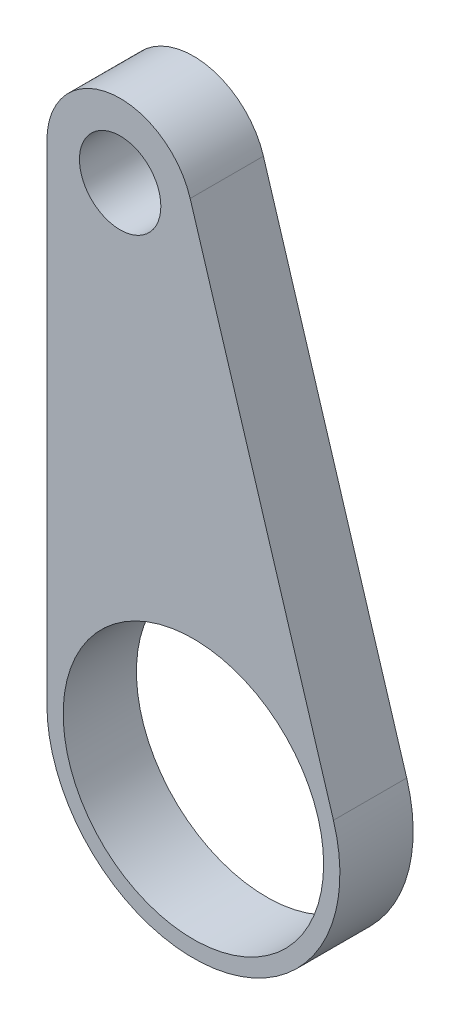
ISO-10303-21;
HEADER;
FILE_DESCRIPTION(('STEP AP214'),'2;1');
FILE_NAME('part.step','',(''),(''),'','','');
FILE_SCHEMA(('AUTOMOTIVE_DESIGN { 1 0 10303 214 1 1 1 1 }'));
ENDSEC;
DATA;
#1=APPLICATION_CONTEXT('core data for automotive mechanical design processes');
#2=APPLICATION_PROTOCOL_DEFINITION('international standard','automotive_design',2000,#1);
#3=PRODUCT_CONTEXT('',#1,'mechanical');
#4=PRODUCT('Part','Part','',(#3));
#5=PRODUCT_RELATED_PRODUCT_CATEGORY('part','',(#4));
#6=PRODUCT_DEFINITION_FORMATION('','',#4);
#7=PRODUCT_DEFINITION_CONTEXT('part definition',#1,'design');
#8=PRODUCT_DEFINITION('design','',#6,#7);
#9=PRODUCT_DEFINITION_SHAPE('','',#8);
#10=(LENGTH_UNIT() NAMED_UNIT(*) SI_UNIT(.MILLI.,.METRE.));
#11=(NAMED_UNIT(*) PLANE_ANGLE_UNIT() SI_UNIT($,.RADIAN.));
#12=(NAMED_UNIT(*) SI_UNIT($,.STERADIAN.) SOLID_ANGLE_UNIT());
#13=UNCERTAINTY_MEASURE_WITH_UNIT(LENGTH_MEASURE(1.E-05),#10,'distance_accuracy_value','');
#14=(GEOMETRIC_REPRESENTATION_CONTEXT(3) GLOBAL_UNCERTAINTY_ASSIGNED_CONTEXT((#13)) GLOBAL_UNIT_ASSIGNED_CONTEXT((#10,
#11,#12)) REPRESENTATION_CONTEXT('',''));
#15=CARTESIAN_POINT('',(0.,0.,0.));
#16=DIRECTION('',(0.,0.,1.));
#17=DIRECTION('',(1.,0.,0.));
#18=AXIS2_PLACEMENT_3D('',#15,#16,#17);
#19=CARTESIAN_POINT('',(-9.,0.,4.5));
#20=DIRECTION('',(-1.,0.,0.));
#21=DIRECTION('',(0.,0.,1.));
#22=AXIS2_PLACEMENT_3D('',#19,#20,#21);
#23=PLANE('',#22);
#24=DIRECTION('',(0.,1.,0.));
#25=VECTOR('',#24,1.);
#26=CARTESIAN_POINT('',(-9.,0.,0.));
#27=LINE('',#26,#25);
#28=CARTESIAN_POINT('',(-9.,0.,0.));
#29=VERTEX_POINT('',#28);
#30=CARTESIAN_POINT('',(-9.,30.,0.));
#31=VERTEX_POINT('',#30);
#32=EDGE_CURVE('E130',#29,#31,#27,.T.);
#33=ORIENTED_EDGE('',*,*,#32,.F.);
#34=DIRECTION('',(0.,0.,-1.));
#35=VECTOR('',#34,1.);
#36=CARTESIAN_POINT('',(-9.,0.,4.5));
#37=LINE('',#36,#35);
#38=CARTESIAN_POINT('',(-9.,0.,4.5));
#39=VERTEX_POINT('',#38);
#40=EDGE_CURVE('E88',#39,#29,#37,.T.);
#41=ORIENTED_EDGE('',*,*,#40,.F.);
#42=DIRECTION('',(0.,1.,0.));
#43=VECTOR('',#42,1.);
#44=CARTESIAN_POINT('',(-9.,0.,4.5));
#45=LINE('',#44,#43);
#46=CARTESIAN_POINT('',(-9.,30.,4.5));
#47=VERTEX_POINT('',#46);
#48=EDGE_CURVE('E128',#39,#47,#45,.T.);
#49=ORIENTED_EDGE('',*,*,#48,.T.);
#50=DIRECTION('',(0.,0.,-1.));
#51=VECTOR('',#50,1.);
#52=CARTESIAN_POINT('',(-9.,30.,4.5));
#53=LINE('',#52,#51);
#54=EDGE_CURVE('E12',#47,#31,#53,.T.);
#55=ORIENTED_EDGE('',*,*,#54,.T.);
#56=EDGE_LOOP('',(#33,#41,#49,#55));
#57=FACE_BOUND('',#56,.T.);
#58=ADVANCED_FACE('F77',(#57),#23,.T.);
#59=CARTESIAN_POINT('',(8.6039119804401,2.64058679706602,4.5));
#60=DIRECTION('',(-0.9559902200489,-0.293398533007335,0.));
#61=DIRECTION('',(0.293398533007335,-0.9559902200489,0.));
#62=AXIS2_PLACEMENT_3D('',#59,#60,#61);
#63=PLANE('',#62);
#64=DIRECTION('',(-0.293398533007335,0.9559902200489,0.));
#65=VECTOR('',#64,1.);
#66=CARTESIAN_POINT('',(8.6039119804401,2.64058679706602,0.));
#67=LINE('',#66,#65);
#68=CARTESIAN_POINT('',(8.6039119804401,2.64058679706602,0.));
#69=VERTEX_POINT('',#68);
#70=CARTESIAN_POINT('',(-0.198044009779951,31.320293398533,0.));
#71=VERTEX_POINT('',#70);
#72=EDGE_CURVE('E159',#69,#71,#67,.T.);
#73=ORIENTED_EDGE('',*,*,#72,.T.);
#74=DIRECTION('',(0.,0.,-1.));
#75=VECTOR('',#74,1.);
#76=CARTESIAN_POINT('',(-0.198044009779951,31.320293398533,4.5));
#77=LINE('',#76,#75);
#78=CARTESIAN_POINT('',(-0.198044009779951,31.320293398533,4.5));
#79=VERTEX_POINT('',#78);
#80=EDGE_CURVE('E119',#79,#71,#77,.T.);
#81=ORIENTED_EDGE('',*,*,#80,.F.);
#82=DIRECTION('',(-0.293398533007335,0.9559902200489,0.));
#83=VECTOR('',#82,1.);
#84=CARTESIAN_POINT('',(8.6039119804401,2.64058679706602,4.5));
#85=LINE('',#84,#83);
#86=CARTESIAN_POINT('',(8.6039119804401,2.64058679706602,4.5));
#87=VERTEX_POINT('',#86);
#88=EDGE_CURVE('E97',#87,#79,#85,.T.);
#89=ORIENTED_EDGE('',*,*,#88,.F.);
#90=DIRECTION('',(0.,0.,-1.));
#91=VECTOR('',#90,1.);
#92=CARTESIAN_POINT('',(8.6039119804401,2.64058679706602,4.5));
#93=LINE('',#92,#91);
#94=EDGE_CURVE('E112',#87,#69,#93,.T.);
#95=ORIENTED_EDGE('',*,*,#94,.T.);
#96=EDGE_LOOP('',(#73,#81,#89,#95));
#97=FACE_BOUND('',#96,.T.);
#98=ADVANCED_FACE('F188',(#97),#63,.F.);
#99=CARTESIAN_POINT('',(-4.5,30.,4.5));
#100=DIRECTION('',(0.,0.,-1.));
#101=DIRECTION('',(-1.,0.,0.));
#102=AXIS2_PLACEMENT_3D('',#99,#100,#101);
#103=CYLINDRICAL_SURFACE('',#102,4.5);
#104=CARTESIAN_POINT('',(-4.5,30.,0.));
#105=DIRECTION('',(0.,0.,1.));
#106=DIRECTION('',(1.,0.,0.));
#107=AXIS2_PLACEMENT_3D('',#104,#105,#106);
#108=CIRCLE('',#107,4.5);
#109=EDGE_CURVE('E153',#31,#71,#108,.F.);
#110=ORIENTED_EDGE('',*,*,#109,.F.);
#111=ORIENTED_EDGE('',*,*,#54,.F.);
#112=CARTESIAN_POINT('',(-4.5,30.,4.5));
#113=DIRECTION('',(0.,0.,1.));
#114=DIRECTION('',(1.,0.,0.));
#115=AXIS2_PLACEMENT_3D('',#112,#113,#114);
#116=CIRCLE('',#115,4.5);
#117=EDGE_CURVE('E140',#47,#79,#116,.F.);
#118=ORIENTED_EDGE('',*,*,#117,.T.);
#119=ORIENTED_EDGE('',*,*,#80,.T.);
#120=EDGE_LOOP('',(#110,#111,#118,#119));
#121=FACE_BOUND('',#120,.T.);
#122=ADVANCED_FACE('F193',(#121),#103,.T.);
#123=CARTESIAN_POINT('',(-4.5,30.,4.5));
#124=DIRECTION('',(0.,0.,-1.));
#125=DIRECTION('',(-1.,0.,0.));
#126=AXIS2_PLACEMENT_3D('',#123,#124,#125);
#127=CYLINDRICAL_SURFACE('',#126,2.5);
#128=CARTESIAN_POINT('',(-4.5,30.,4.5));
#129=DIRECTION('',(0.,0.,1.));
#130=DIRECTION('',(1.,0.,0.));
#131=AXIS2_PLACEMENT_3D('',#128,#129,#130);
#132=CIRCLE('',#131,2.5);
#133=CARTESIAN_POINT('',(-2.,30.,4.5));
#134=VERTEX_POINT('',#133);
#135=EDGE_CURVE('E146',#134,#134,#132,.T.);
#136=ORIENTED_EDGE('',*,*,#135,.T.);
#137=EDGE_LOOP('',(#136));
#138=FACE_BOUND('',#137,.T.);
#139=CARTESIAN_POINT('',(-4.5,30.,0.));
#140=DIRECTION('',(0.,0.,1.));
#141=DIRECTION('',(1.,0.,0.));
#142=AXIS2_PLACEMENT_3D('',#139,#140,#141);
#143=CIRCLE('',#142,2.5);
#144=CARTESIAN_POINT('',(-2.,30.,0.));
#145=VERTEX_POINT('',#144);
#146=EDGE_CURVE('E137',#145,#145,#143,.T.);
#147=ORIENTED_EDGE('',*,*,#146,.F.);
#148=EDGE_LOOP('',(#147));
#149=FACE_BOUND('',#148,.T.);
#150=ADVANCED_FACE('F198',(#138,#149),#127,.F.);
#151=CARTESIAN_POINT('',(0.,0.,0.));
#152=DIRECTION('',(0.,0.,1.));
#153=DIRECTION('',(1.,0.,0.));
#154=AXIS2_PLACEMENT_3D('',#151,#152,#153);
#155=PLANE('',#154);
#156=ORIENTED_EDGE('',*,*,#146,.T.);
#157=EDGE_LOOP('',(#156));
#158=FACE_BOUND('',#157,.T.);
#159=ORIENTED_EDGE('',*,*,#109,.T.);
#160=ORIENTED_EDGE('',*,*,#72,.F.);
#161=CARTESIAN_POINT('',(0.,0.,0.));
#162=DIRECTION('',(0.,0.,1.));
#163=DIRECTION('',(1.,0.,0.));
#164=AXIS2_PLACEMENT_3D('',#161,#162,#163);
#165=CIRCLE('',#164,9.);
#166=EDGE_CURVE('E81',#29,#69,#165,.T.);
#167=ORIENTED_EDGE('',*,*,#166,.F.);
#168=ORIENTED_EDGE('',*,*,#32,.T.);
#169=EDGE_LOOP('',(#159,#160,#167,#168));
#170=FACE_BOUND('',#169,.T.);
#171=CARTESIAN_POINT('',(0.,0.,0.));
#172=DIRECTION('',(0.,0.,1.));
#173=DIRECTION('',(1.,0.,0.));
#174=AXIS2_PLACEMENT_3D('',#171,#172,#173);
#175=CIRCLE('',#174,8.);
#176=CARTESIAN_POINT('',(8.,0.,0.));
#177=VERTEX_POINT('',#176);
#178=EDGE_CURVE('E170',#177,#177,#175,.T.);
#179=ORIENTED_EDGE('',*,*,#178,.T.);
#180=EDGE_LOOP('',(#179));
#181=FACE_BOUND('',#180,.T.);
#182=ADVANCED_FACE('F175',(#158,#170,#181),#155,.F.);
#183=CARTESIAN_POINT('',(0.,0.,4.5));
#184=DIRECTION('',(0.,0.,1.));
#185=DIRECTION('',(1.,0.,0.));
#186=AXIS2_PLACEMENT_3D('',#183,#184,#185);
#187=PLANE('',#186);
#188=ORIENTED_EDGE('',*,*,#135,.F.);
#189=EDGE_LOOP('',(#188));
#190=FACE_BOUND('',#189,.T.);
#191=ORIENTED_EDGE('',*,*,#117,.F.);
#192=ORIENTED_EDGE('',*,*,#48,.F.);
#193=CARTESIAN_POINT('',(0.,0.,4.5));
#194=DIRECTION('',(0.,0.,1.));
#195=DIRECTION('',(1.,0.,0.));
#196=AXIS2_PLACEMENT_3D('',#193,#194,#195);
#197=CIRCLE('',#196,9.);
#198=EDGE_CURVE('E135',#39,#87,#197,.T.);
#199=ORIENTED_EDGE('',*,*,#198,.T.);
#200=ORIENTED_EDGE('',*,*,#88,.T.);
#201=EDGE_LOOP('',(#191,#192,#199,#200));
#202=FACE_BOUND('',#201,.T.);
#203=CARTESIAN_POINT('',(0.,0.,4.5));
#204=DIRECTION('',(0.,0.,1.));
#205=DIRECTION('',(1.,0.,0.));
#206=AXIS2_PLACEMENT_3D('',#203,#204,#205);
#207=CIRCLE('',#206,8.);
#208=CARTESIAN_POINT('',(8.,0.,4.5));
#209=VERTEX_POINT('',#208);
#210=EDGE_CURVE('E166',#209,#209,#207,.T.);
#211=ORIENTED_EDGE('',*,*,#210,.F.);
#212=EDGE_LOOP('',(#211));
#213=FACE_BOUND('',#212,.T.);
#214=ADVANCED_FACE('F138',(#190,#202,#213),#187,.T.);
#215=CARTESIAN_POINT('',(0.,0.,4.5));
#216=DIRECTION('',(0.,0.,-1.));
#217=DIRECTION('',(-1.,0.,0.));
#218=AXIS2_PLACEMENT_3D('',#215,#216,#217);
#219=CYLINDRICAL_SURFACE('',#218,8.);
#220=ORIENTED_EDGE('',*,*,#210,.T.);
#221=EDGE_LOOP('',(#220));
#222=FACE_BOUND('',#221,.T.);
#223=ORIENTED_EDGE('',*,*,#178,.F.);
#224=EDGE_LOOP('',(#223));
#225=FACE_BOUND('',#224,.T.);
#226=ADVANCED_FACE('F177',(#222,#225),#219,.F.);
#227=CARTESIAN_POINT('',(0.,0.,4.5));
#228=DIRECTION('',(0.,0.,-1.));
#229=DIRECTION('',(-1.,0.,0.));
#230=AXIS2_PLACEMENT_3D('',#227,#228,#229);
#231=CYLINDRICAL_SURFACE('',#230,9.);
#232=ORIENTED_EDGE('',*,*,#40,.T.);
#233=ORIENTED_EDGE('',*,*,#166,.T.);
#234=ORIENTED_EDGE('',*,*,#94,.F.);
#235=ORIENTED_EDGE('',*,*,#198,.F.);
#236=EDGE_LOOP('',(#232,#233,#234,#235));
#237=FACE_BOUND('',#236,.T.);
#238=ADVANCED_FACE('F79',(#237),#231,.T.);
#239=CLOSED_SHELL('',(#58,#98,#122,#150,#182,#214,#226,#238));
#240=MANIFOLD_SOLID_BREP('B2',#239);
#241=ADVANCED_BREP_SHAPE_REPRESENTATION('',(#18,#240),#14);
#242=SHAPE_DEFINITION_REPRESENTATION(#9,#241);
ENDSEC;
END-ISO-10303-21;
